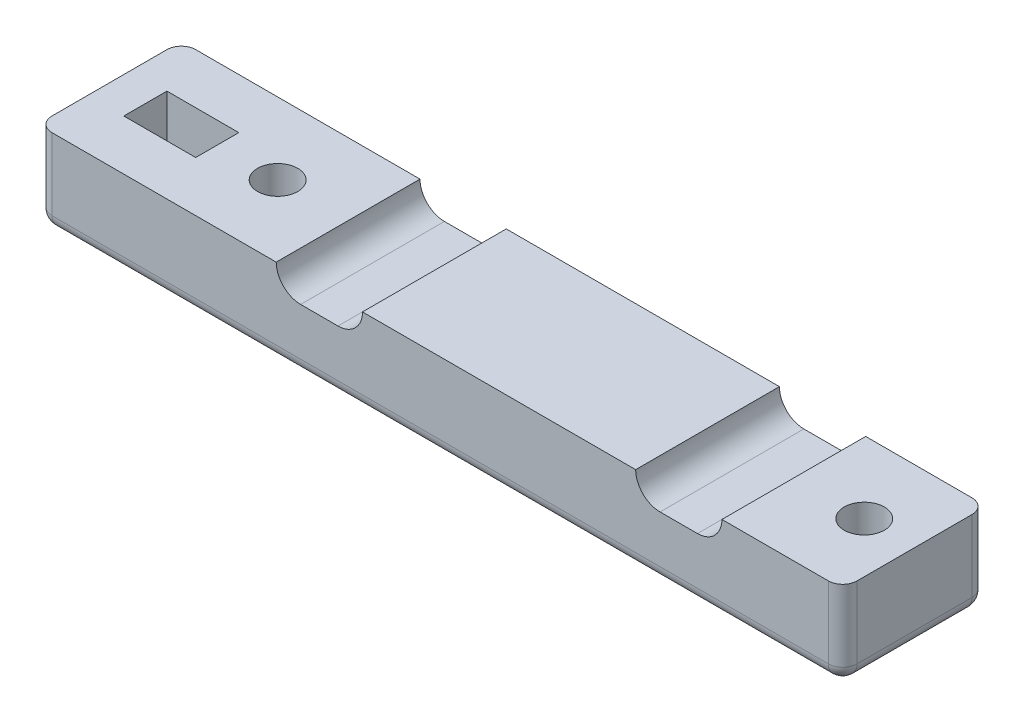
ISO-10303-21;
HEADER;
FILE_DESCRIPTION(('STEP AP214'),'2;1');
FILE_NAME('part.step','',(''),(''),'','','');
FILE_SCHEMA(('AUTOMOTIVE_DESIGN { 1 0 10303 214 1 1 1 1 }'));
ENDSEC;
DATA;
#1=APPLICATION_CONTEXT('core data for automotive mechanical design processes');
#2=APPLICATION_PROTOCOL_DEFINITION('international standard','automotive_design',2000,#1);
#3=PRODUCT_CONTEXT('',#1,'mechanical');
#4=PRODUCT('Part','Part','',(#3));
#5=PRODUCT_RELATED_PRODUCT_CATEGORY('part','',(#4));
#6=PRODUCT_DEFINITION_FORMATION('','',#4);
#7=PRODUCT_DEFINITION_CONTEXT('part definition',#1,'design');
#8=PRODUCT_DEFINITION('design','',#6,#7);
#9=PRODUCT_DEFINITION_SHAPE('','',#8);
#10=(LENGTH_UNIT() NAMED_UNIT(*) SI_UNIT(.MILLI.,.METRE.));
#11=(NAMED_UNIT(*) PLANE_ANGLE_UNIT() SI_UNIT($,.RADIAN.));
#12=(NAMED_UNIT(*) SI_UNIT($,.STERADIAN.) SOLID_ANGLE_UNIT());
#13=UNCERTAINTY_MEASURE_WITH_UNIT(LENGTH_MEASURE(1.E-05),#10,'distance_accuracy_value','');
#14=(GEOMETRIC_REPRESENTATION_CONTEXT(3) GLOBAL_UNCERTAINTY_ASSIGNED_CONTEXT((#13)) GLOBAL_UNIT_ASSIGNED_CONTEXT((#10,
#11,#12)) REPRESENTATION_CONTEXT('',''));
#15=CARTESIAN_POINT('',(0.,0.,0.));
#16=DIRECTION('',(0.,0.,1.));
#17=DIRECTION('',(1.,0.,0.));
#18=AXIS2_PLACEMENT_3D('',#15,#16,#17);
#19=CARTESIAN_POINT('',(0.,6.,0.));
#20=DIRECTION('',(0.,1.,0.));
#21=DIRECTION('',(0.,0.,1.));
#22=AXIS2_PLACEMENT_3D('',#19,#20,#21);
#23=PLANE('',#22);
#24=DIRECTION('',(0.,0.,-1.));
#25=VECTOR('',#24,1.);
#26=CARTESIAN_POINT('',(13.6,6.,5.));
#27=LINE('',#26,#25);
#28=CARTESIAN_POINT('',(13.6,6.,5.));
#29=VERTEX_POINT('',#28);
#30=CARTESIAN_POINT('',(13.6,6.,-5.));
#31=VERTEX_POINT('',#30);
#32=EDGE_CURVE('E188',#29,#31,#27,.T.);
#33=ORIENTED_EDGE('',*,*,#32,.T.);
#34=DIRECTION('',(-1.,0.,0.));
#35=VECTOR('',#34,1.);
#36=CARTESIAN_POINT('',(-28.,6.,-5.));
#37=LINE('',#36,#35);
#38=CARTESIAN_POINT('',(-5.4,6.,-5.));
#39=VERTEX_POINT('',#38);
#40=EDGE_CURVE('E368',#31,#39,#37,.T.);
#41=ORIENTED_EDGE('',*,*,#40,.T.);
#42=DIRECTION('',(0.,0.,-1.));
#43=VECTOR('',#42,1.);
#44=CARTESIAN_POINT('',(-5.4,6.,5.));
#45=LINE('',#44,#43);
#46=CARTESIAN_POINT('',(-5.4,6.,5.));
#47=VERTEX_POINT('',#46);
#48=EDGE_CURVE('E212',#47,#39,#45,.T.);
#49=ORIENTED_EDGE('',*,*,#48,.F.);
#50=DIRECTION('',(1.,0.,0.));
#51=VECTOR('',#50,1.);
#52=CARTESIAN_POINT('',(-28.,6.,5.));
#53=LINE('',#52,#51);
#54=EDGE_CURVE('E206',#47,#29,#53,.T.);
#55=ORIENTED_EDGE('',*,*,#54,.T.);
#56=EDGE_LOOP('',(#33,#41,#49,#55));
#57=FACE_BOUND('',#56,.T.);
#58=ADVANCED_FACE('F37',(#57),#23,.T.);
#59=DIRECTION('',(0.,0.,-1.));
#60=VECTOR('',#59,1.);
#61=CARTESIAN_POINT('',(28.,6.,-5.));
#62=LINE('',#61,#60);
#63=CARTESIAN_POINT('',(28.,6.,4.));
#64=VERTEX_POINT('',#63);
#65=CARTESIAN_POINT('',(28.,6.,-4.));
#66=VERTEX_POINT('',#65);
#67=EDGE_CURVE('E362',#64,#66,#62,.T.);
#68=ORIENTED_EDGE('',*,*,#67,.T.);
#69=CARTESIAN_POINT('',(27.,6.,-4.));
#70=DIRECTION('',(0.,1.,0.));
#71=DIRECTION('',(0.,0.,1.));
#72=AXIS2_PLACEMENT_3D('',#69,#70,#71);
#73=CIRCLE('',#72,1.);
#74=CARTESIAN_POINT('',(27.,6.,-5.));
#75=VERTEX_POINT('',#74);
#76=EDGE_CURVE('E236',#66,#75,#73,.T.);
#77=ORIENTED_EDGE('',*,*,#76,.T.);
#78=CARTESIAN_POINT('',(19.6,6.,-5.));
#79=VERTEX_POINT('',#78);
#80=EDGE_CURVE('E367',#75,#79,#37,.T.);
#81=ORIENTED_EDGE('',*,*,#80,.T.);
#82=DIRECTION('',(0.,0.,-1.));
#83=VECTOR('',#82,1.);
#84=CARTESIAN_POINT('',(19.6,6.,5.));
#85=LINE('',#84,#83);
#86=CARTESIAN_POINT('',(19.6,6.,5.));
#87=VERTEX_POINT('',#86);
#88=EDGE_CURVE('E199',#87,#79,#85,.T.);
#89=ORIENTED_EDGE('',*,*,#88,.F.);
#90=CARTESIAN_POINT('',(27.,6.,5.));
#91=VERTEX_POINT('',#90);
#92=EDGE_CURVE('E214',#87,#91,#53,.T.);
#93=ORIENTED_EDGE('',*,*,#92,.T.);
#94=CARTESIAN_POINT('',(27.,6.,4.));
#95=DIRECTION('',(0.,1.,0.));
#96=DIRECTION('',(0.,0.,1.));
#97=AXIS2_PLACEMENT_3D('',#94,#95,#96);
#98=CIRCLE('',#97,1.);
#99=EDGE_CURVE('E234',#91,#64,#98,.T.);
#100=ORIENTED_EDGE('',*,*,#99,.T.);
#101=EDGE_LOOP('',(#68,#77,#81,#89,#93,#100));
#102=FACE_BOUND('',#101,.T.);
#103=CARTESIAN_POINT('',(24.5,6.,0.));
#104=DIRECTION('',(0.,1.,0.));
#105=DIRECTION('',(0.,0.,1.));
#106=AXIS2_PLACEMENT_3D('',#103,#104,#105);
#107=CIRCLE('',#106,1.4);
#108=CARTESIAN_POINT('',(24.5,6.,1.4));
#109=VERTEX_POINT('',#108);
#110=EDGE_CURVE('E353',#109,#109,#107,.T.);
#111=ORIENTED_EDGE('',*,*,#110,.F.);
#112=EDGE_LOOP('',(#111));
#113=FACE_BOUND('',#112,.T.);
#114=ADVANCED_FACE('F417',(#102,#113),#23,.T.);
#115=CARTESIAN_POINT('',(-11.4,6.,-5.));
#116=VERTEX_POINT('',#115);
#117=CARTESIAN_POINT('',(-27.,6.,-5.));
#118=VERTEX_POINT('',#117);
#119=EDGE_CURVE('E366',#116,#118,#37,.T.);
#120=ORIENTED_EDGE('',*,*,#119,.T.);
#121=CARTESIAN_POINT('',(-27.,6.,-4.));
#122=DIRECTION('',(0.,1.,0.));
#123=DIRECTION('',(0.,0.,1.));
#124=AXIS2_PLACEMENT_3D('',#121,#122,#123);
#125=CIRCLE('',#124,1.);
#126=CARTESIAN_POINT('',(-28.,6.,-4.));
#127=VERTEX_POINT('',#126);
#128=EDGE_CURVE('E252',#118,#127,#125,.T.);
#129=ORIENTED_EDGE('',*,*,#128,.T.);
#130=DIRECTION('',(0.,0.,1.));
#131=VECTOR('',#130,1.);
#132=CARTESIAN_POINT('',(-28.,6.,-5.));
#133=LINE('',#132,#131);
#134=CARTESIAN_POINT('',(-28.,6.,4.));
#135=VERTEX_POINT('',#134);
#136=EDGE_CURVE('E218',#127,#135,#133,.T.);
#137=ORIENTED_EDGE('',*,*,#136,.T.);
#138=CARTESIAN_POINT('',(-27.,6.,4.));
#139=DIRECTION('',(0.,1.,0.));
#140=DIRECTION('',(0.,0.,1.));
#141=AXIS2_PLACEMENT_3D('',#138,#139,#140);
#142=CIRCLE('',#141,1.);
#143=CARTESIAN_POINT('',(-27.,6.,5.));
#144=VERTEX_POINT('',#143);
#145=EDGE_CURVE('E250',#135,#144,#142,.T.);
#146=ORIENTED_EDGE('',*,*,#145,.T.);
#147=CARTESIAN_POINT('',(-11.4,6.,5.));
#148=VERTEX_POINT('',#147);
#149=EDGE_CURVE('E213',#144,#148,#53,.T.);
#150=ORIENTED_EDGE('',*,*,#149,.T.);
#151=DIRECTION('',(0.,0.,-1.));
#152=VECTOR('',#151,1.);
#153=CARTESIAN_POINT('',(-11.4,6.,5.));
#154=LINE('',#153,#152);
#155=EDGE_CURVE('E294',#148,#116,#154,.T.);
#156=ORIENTED_EDGE('',*,*,#155,.T.);
#157=EDGE_LOOP('',(#120,#129,#137,#146,#150,#156));
#158=FACE_BOUND('',#157,.T.);
#159=CARTESIAN_POINT('',(-16.3,6.,0.));
#160=DIRECTION('',(0.,1.,0.));
#161=DIRECTION('',(0.,0.,1.));
#162=AXIS2_PLACEMENT_3D('',#159,#160,#161);
#163=CIRCLE('',#162,1.4);
#164=CARTESIAN_POINT('',(-16.3,6.,1.4));
#165=VERTEX_POINT('',#164);
#166=EDGE_CURVE('E359',#165,#165,#163,.T.);
#167=ORIENTED_EDGE('',*,*,#166,.F.);
#168=EDGE_LOOP('',(#167));
#169=FACE_BOUND('',#168,.T.);
#170=DIRECTION('',(1.,0.,0.));
#171=VECTOR('',#170,1.);
#172=CARTESIAN_POINT('',(-25.5,6.,1.5));
#173=LINE('',#172,#171);
#174=CARTESIAN_POINT('',(-25.5,6.,1.5));
#175=VERTEX_POINT('',#174);
#176=CARTESIAN_POINT('',(-20.5,6.,1.5));
#177=VERTEX_POINT('',#176);
#178=EDGE_CURVE('E322',#175,#177,#173,.T.);
#179=ORIENTED_EDGE('',*,*,#178,.F.);
#180=DIRECTION('',(0.,0.,1.));
#181=VECTOR('',#180,1.);
#182=CARTESIAN_POINT('',(-25.5,6.,-1.5));
#183=LINE('',#182,#181);
#184=CARTESIAN_POINT('',(-25.5,6.,-1.5));
#185=VERTEX_POINT('',#184);
#186=EDGE_CURVE('E320',#185,#175,#183,.T.);
#187=ORIENTED_EDGE('',*,*,#186,.F.);
#188=DIRECTION('',(-1.,0.,0.));
#189=VECTOR('',#188,1.);
#190=CARTESIAN_POINT('',(-25.5,6.,-1.5));
#191=LINE('',#190,#189);
#192=CARTESIAN_POINT('',(-20.5,6.,-1.5));
#193=VERTEX_POINT('',#192);
#194=EDGE_CURVE('E328',#193,#185,#191,.T.);
#195=ORIENTED_EDGE('',*,*,#194,.F.);
#196=DIRECTION('',(0.,0.,-1.));
#197=VECTOR('',#196,1.);
#198=CARTESIAN_POINT('',(-20.5,6.,-1.5));
#199=LINE('',#198,#197);
#200=EDGE_CURVE('E325',#177,#193,#199,.T.);
#201=ORIENTED_EDGE('',*,*,#200,.F.);
#202=EDGE_LOOP('',(#179,#187,#195,#201));
#203=FACE_BOUND('',#202,.T.);
#204=ADVANCED_FACE('F378',(#158,#169,#203),#23,.T.);
#205=CARTESIAN_POINT('',(0.,0.,0.));
#206=DIRECTION('',(0.,1.,0.));
#207=DIRECTION('',(0.,0.,1.));
#208=AXIS2_PLACEMENT_3D('',#205,#206,#207);
#209=PLANE('',#208);
#210=DIRECTION('',(1.,0.,0.));
#211=VECTOR('',#210,1.);
#212=CARTESIAN_POINT('',(0.,0.,4.));
#213=LINE('',#212,#211);
#214=CARTESIAN_POINT('',(27.,0.,4.));
#215=VERTEX_POINT('',#214);
#216=CARTESIAN_POINT('',(-27.,0.,4.));
#217=VERTEX_POINT('',#216);
#218=EDGE_CURVE('E60',#215,#217,#213,.F.);
#219=ORIENTED_EDGE('',*,*,#218,.T.);
#220=DIRECTION('',(0.,0.,1.));
#221=VECTOR('',#220,1.);
#222=CARTESIAN_POINT('',(-27.,0.,0.));
#223=LINE('',#222,#221);
#224=CARTESIAN_POINT('',(-27.,0.,-4.));
#225=VERTEX_POINT('',#224);
#226=EDGE_CURVE('E11',#217,#225,#223,.F.);
#227=ORIENTED_EDGE('',*,*,#226,.T.);
#228=DIRECTION('',(-1.,0.,0.));
#229=VECTOR('',#228,1.);
#230=CARTESIAN_POINT('',(0.,0.,-4.));
#231=LINE('',#230,#229);
#232=CARTESIAN_POINT('',(27.,0.,-4.));
#233=VERTEX_POINT('',#232);
#234=EDGE_CURVE('E46',#225,#233,#231,.F.);
#235=ORIENTED_EDGE('',*,*,#234,.T.);
#236=DIRECTION('',(0.,0.,-1.));
#237=VECTOR('',#236,1.);
#238=CARTESIAN_POINT('',(27.,0.,0.));
#239=LINE('',#238,#237);
#240=EDGE_CURVE('E254',#233,#215,#239,.F.);
#241=ORIENTED_EDGE('',*,*,#240,.T.);
#242=EDGE_LOOP('',(#219,#227,#235,#241));
#243=FACE_BOUND('',#242,.T.);
#244=CARTESIAN_POINT('',(24.5,0.,0.));
#245=DIRECTION('',(0.,1.,0.));
#246=DIRECTION('',(0.,0.,1.));
#247=AXIS2_PLACEMENT_3D('',#244,#245,#246);
#248=CIRCLE('',#247,1.4);
#249=CARTESIAN_POINT('',(24.5,0.,1.4));
#250=VERTEX_POINT('',#249);
#251=EDGE_CURVE('E352',#250,#250,#248,.T.);
#252=ORIENTED_EDGE('',*,*,#251,.T.);
#253=EDGE_LOOP('',(#252));
#254=FACE_BOUND('',#253,.T.);
#255=CARTESIAN_POINT('',(-16.3,0.,0.));
#256=DIRECTION('',(0.,1.,0.));
#257=DIRECTION('',(0.,0.,1.));
#258=AXIS2_PLACEMENT_3D('',#255,#256,#257);
#259=CIRCLE('',#258,1.4);
#260=CARTESIAN_POINT('',(-16.3,0.,1.4));
#261=VERTEX_POINT('',#260);
#262=EDGE_CURVE('E356',#261,#261,#259,.T.);
#263=ORIENTED_EDGE('',*,*,#262,.T.);
#264=EDGE_LOOP('',(#263));
#265=FACE_BOUND('',#264,.T.);
#266=DIRECTION('',(0.,0.,1.));
#267=VECTOR('',#266,1.);
#268=CARTESIAN_POINT('',(-25.5,0.,-1.5));
#269=LINE('',#268,#267);
#270=CARTESIAN_POINT('',(-25.5,0.,-1.5));
#271=VERTEX_POINT('',#270);
#272=CARTESIAN_POINT('',(-25.5,0.,1.5));
#273=VERTEX_POINT('',#272);
#274=EDGE_CURVE('E331',#271,#273,#269,.T.);
#275=ORIENTED_EDGE('',*,*,#274,.T.);
#276=DIRECTION('',(1.,0.,0.));
#277=VECTOR('',#276,1.);
#278=CARTESIAN_POINT('',(-25.5,0.,1.5));
#279=LINE('',#278,#277);
#280=CARTESIAN_POINT('',(-20.5,0.,1.5));
#281=VERTEX_POINT('',#280);
#282=EDGE_CURVE('E334',#273,#281,#279,.T.);
#283=ORIENTED_EDGE('',*,*,#282,.T.);
#284=DIRECTION('',(0.,0.,-1.));
#285=VECTOR('',#284,1.);
#286=CARTESIAN_POINT('',(-20.5,0.,-1.5));
#287=LINE('',#286,#285);
#288=CARTESIAN_POINT('',(-20.5,0.,-1.5));
#289=VERTEX_POINT('',#288);
#290=EDGE_CURVE('E338',#281,#289,#287,.T.);
#291=ORIENTED_EDGE('',*,*,#290,.T.);
#292=DIRECTION('',(-1.,0.,0.));
#293=VECTOR('',#292,1.);
#294=CARTESIAN_POINT('',(-25.5,0.,-1.5));
#295=LINE('',#294,#293);
#296=EDGE_CURVE('E323',#289,#271,#295,.T.);
#297=ORIENTED_EDGE('',*,*,#296,.T.);
#298=EDGE_LOOP('',(#275,#283,#291,#297));
#299=FACE_BOUND('',#298,.T.);
#300=ADVANCED_FACE('F395',(#243,#254,#265,#299),#209,.F.);
#301=CARTESIAN_POINT('',(28.,6.,-5.));
#302=DIRECTION('',(-1.,0.,0.));
#303=DIRECTION('',(0.,0.,1.));
#304=AXIS2_PLACEMENT_3D('',#301,#302,#303);
#305=PLANE('',#304);
#306=DIRECTION('',(0.,0.,-1.));
#307=VECTOR('',#306,1.);
#308=CARTESIAN_POINT('',(28.,1.,-5.));
#309=LINE('',#308,#307);
#310=CARTESIAN_POINT('',(28.,1.,4.));
#311=VERTEX_POINT('',#310);
#312=CARTESIAN_POINT('',(28.,1.,-4.));
#313=VERTEX_POINT('',#312);
#314=EDGE_CURVE('E228',#311,#313,#309,.T.);
#315=ORIENTED_EDGE('',*,*,#314,.T.);
#316=DIRECTION('',(0.,-1.,0.));
#317=VECTOR('',#316,1.);
#318=CARTESIAN_POINT('',(28.,6.,-4.));
#319=LINE('',#318,#317);
#320=EDGE_CURVE('E232',#313,#66,#319,.F.);
#321=ORIENTED_EDGE('',*,*,#320,.T.);
#322=ORIENTED_EDGE('',*,*,#67,.F.);
#323=DIRECTION('',(0.,-1.,0.));
#324=VECTOR('',#323,1.);
#325=CARTESIAN_POINT('',(28.,6.,4.));
#326=LINE('',#325,#324);
#327=EDGE_CURVE('E230',#64,#311,#326,.T.);
#328=ORIENTED_EDGE('',*,*,#327,.T.);
#329=EDGE_LOOP('',(#315,#321,#322,#328));
#330=FACE_BOUND('',#329,.T.);
#331=ADVANCED_FACE('F415',(#330),#305,.F.);
#332=CARTESIAN_POINT('',(-28.,6.,-5.));
#333=DIRECTION('',(0.,0.,1.));
#334=DIRECTION('',(1.,0.,0.));
#335=AXIS2_PLACEMENT_3D('',#332,#333,#334);
#336=PLANE('',#335);
#337=ORIENTED_EDGE('',*,*,#80,.F.);
#338=DIRECTION('',(0.,-1.,0.));
#339=VECTOR('',#338,1.);
#340=CARTESIAN_POINT('',(27.,6.,-5.));
#341=LINE('',#340,#339);
#342=CARTESIAN_POINT('',(27.,1.,-5.));
#343=VERTEX_POINT('',#342);
#344=EDGE_CURVE('E225',#75,#343,#341,.T.);
#345=ORIENTED_EDGE('',*,*,#344,.T.);
#346=DIRECTION('',(-1.,0.,0.));
#347=VECTOR('',#346,1.);
#348=CARTESIAN_POINT('',(-28.,1.,-5.));
#349=LINE('',#348,#347);
#350=CARTESIAN_POINT('',(-27.,1.,-5.));
#351=VERTEX_POINT('',#350);
#352=EDGE_CURVE('E216',#343,#351,#349,.T.);
#353=ORIENTED_EDGE('',*,*,#352,.T.);
#354=DIRECTION('',(0.,-1.,0.));
#355=VECTOR('',#354,1.);
#356=CARTESIAN_POINT('',(-27.,6.,-5.));
#357=LINE('',#356,#355);
#358=EDGE_CURVE('E223',#351,#118,#357,.F.);
#359=ORIENTED_EDGE('',*,*,#358,.T.);
#360=ORIENTED_EDGE('',*,*,#119,.F.);
#361=CARTESIAN_POINT('',(-9.7,6.,-5.));
#362=DIRECTION('',(0.,0.,-1.));
#363=DIRECTION('',(-1.,0.,0.));
#364=AXIS2_PLACEMENT_3D('',#361,#362,#363);
#365=CIRCLE('',#364,1.7);
#366=CARTESIAN_POINT('',(-9.7,4.3,-5.));
#367=VERTEX_POINT('',#366);
#368=EDGE_CURVE('E304',#367,#116,#365,.T.);
#369=ORIENTED_EDGE('',*,*,#368,.F.);
#370=DIRECTION('',(-1.,0.,0.));
#371=VECTOR('',#370,1.);
#372=CARTESIAN_POINT('',(-7.1,4.3,-5.));
#373=LINE('',#372,#371);
#374=CARTESIAN_POINT('',(-7.1,4.3,-5.));
#375=VERTEX_POINT('',#374);
#376=EDGE_CURVE('E306',#375,#367,#373,.T.);
#377=ORIENTED_EDGE('',*,*,#376,.F.);
#378=CARTESIAN_POINT('',(-7.1,6.,-5.));
#379=DIRECTION('',(0.,0.,-1.));
#380=DIRECTION('',(1.,0.,0.));
#381=AXIS2_PLACEMENT_3D('',#378,#379,#380);
#382=CIRCLE('',#381,1.7);
#383=EDGE_CURVE('E310',#39,#375,#382,.T.);
#384=ORIENTED_EDGE('',*,*,#383,.F.);
#385=ORIENTED_EDGE('',*,*,#40,.F.);
#386=CARTESIAN_POINT('',(15.3,6.,-5.));
#387=DIRECTION('',(0.,0.,-1.));
#388=DIRECTION('',(-1.,0.,0.));
#389=AXIS2_PLACEMENT_3D('',#386,#387,#388);
#390=CIRCLE('',#389,1.7);
#391=CARTESIAN_POINT('',(15.3,4.3,-5.));
#392=VERTEX_POINT('',#391);
#393=EDGE_CURVE('E194',#392,#31,#390,.T.);
#394=ORIENTED_EDGE('',*,*,#393,.F.);
#395=DIRECTION('',(-1.,0.,0.));
#396=VECTOR('',#395,1.);
#397=CARTESIAN_POINT('',(17.9,4.3,-5.));
#398=LINE('',#397,#396);
#399=CARTESIAN_POINT('',(17.9,4.3,-5.));
#400=VERTEX_POINT('',#399);
#401=EDGE_CURVE('E209',#400,#392,#398,.T.);
#402=ORIENTED_EDGE('',*,*,#401,.F.);
#403=CARTESIAN_POINT('',(17.9,6.,-5.));
#404=DIRECTION('',(0.,0.,-1.));
#405=DIRECTION('',(1.,0.,0.));
#406=AXIS2_PLACEMENT_3D('',#403,#404,#405);
#407=CIRCLE('',#406,1.7);
#408=EDGE_CURVE('E801',#79,#400,#407,.T.);
#409=ORIENTED_EDGE('',*,*,#408,.F.);
#410=EDGE_LOOP('',(#337,#345,#353,#359,#360,#369,#377,#384,#385,#394,#402,#409));
#411=FACE_BOUND('',#410,.T.);
#412=ADVANCED_FACE('F454',(#411),#336,.F.);
#413=CARTESIAN_POINT('',(-28.,6.,-5.));
#414=DIRECTION('',(1.,0.,0.));
#415=DIRECTION('',(0.,0.,-1.));
#416=AXIS2_PLACEMENT_3D('',#413,#414,#415);
#417=PLANE('',#416);
#418=ORIENTED_EDGE('',*,*,#136,.F.);
#419=DIRECTION('',(0.,-1.,0.));
#420=VECTOR('',#419,1.);
#421=CARTESIAN_POINT('',(-28.,6.,-4.));
#422=LINE('',#421,#420);
#423=CARTESIAN_POINT('',(-28.,1.,-4.));
#424=VERTEX_POINT('',#423);
#425=EDGE_CURVE('E248',#127,#424,#422,.T.);
#426=ORIENTED_EDGE('',*,*,#425,.T.);
#427=DIRECTION('',(0.,0.,1.));
#428=VECTOR('',#427,1.);
#429=CARTESIAN_POINT('',(-28.,1.,-5.));
#430=LINE('',#429,#428);
#431=CARTESIAN_POINT('',(-28.,1.,4.));
#432=VERTEX_POINT('',#431);
#433=EDGE_CURVE('E244',#424,#432,#430,.T.);
#434=ORIENTED_EDGE('',*,*,#433,.T.);
#435=DIRECTION('',(0.,-1.,0.));
#436=VECTOR('',#435,1.);
#437=CARTESIAN_POINT('',(-28.,6.,4.));
#438=LINE('',#437,#436);
#439=EDGE_CURVE('E246',#432,#135,#438,.F.);
#440=ORIENTED_EDGE('',*,*,#439,.T.);
#441=EDGE_LOOP('',(#418,#426,#434,#440));
#442=FACE_BOUND('',#441,.T.);
#443=ADVANCED_FACE('F390',(#442),#417,.F.);
#444=CARTESIAN_POINT('',(-28.,6.,5.));
#445=DIRECTION('',(0.,0.,-1.));
#446=DIRECTION('',(-1.,0.,0.));
#447=AXIS2_PLACEMENT_3D('',#444,#445,#446);
#448=PLANE('',#447);
#449=DIRECTION('',(1.,0.,0.));
#450=VECTOR('',#449,1.);
#451=CARTESIAN_POINT('',(-28.,1.,5.));
#452=LINE('',#451,#450);
#453=CARTESIAN_POINT('',(-27.,1.,5.));
#454=VERTEX_POINT('',#453);
#455=CARTESIAN_POINT('',(27.,1.,5.));
#456=VERTEX_POINT('',#455);
#457=EDGE_CURVE('E238',#454,#456,#452,.T.);
#458=ORIENTED_EDGE('',*,*,#457,.T.);
#459=DIRECTION('',(0.,-1.,0.));
#460=VECTOR('',#459,1.);
#461=CARTESIAN_POINT('',(27.,6.,5.));
#462=LINE('',#461,#460);
#463=EDGE_CURVE('E242',#456,#91,#462,.F.);
#464=ORIENTED_EDGE('',*,*,#463,.T.);
#465=ORIENTED_EDGE('',*,*,#92,.F.);
#466=CARTESIAN_POINT('',(17.9,6.,5.));
#467=DIRECTION('',(0.,0.,-1.));
#468=DIRECTION('',(1.,0.,0.));
#469=AXIS2_PLACEMENT_3D('',#466,#467,#468);
#470=CIRCLE('',#469,1.7);
#471=CARTESIAN_POINT('',(17.9,4.3,5.));
#472=VERTEX_POINT('',#471);
#473=EDGE_CURVE('E208',#87,#472,#470,.T.);
#474=ORIENTED_EDGE('',*,*,#473,.T.);
#475=DIRECTION('',(-1.,0.,0.));
#476=VECTOR('',#475,1.);
#477=CARTESIAN_POINT('',(17.9,4.3,5.));
#478=LINE('',#477,#476);
#479=CARTESIAN_POINT('',(15.3,4.3,5.));
#480=VERTEX_POINT('',#479);
#481=EDGE_CURVE('E200',#472,#480,#478,.T.);
#482=ORIENTED_EDGE('',*,*,#481,.T.);
#483=CARTESIAN_POINT('',(15.3,6.,5.));
#484=DIRECTION('',(0.,0.,-1.));
#485=DIRECTION('',(-1.,0.,0.));
#486=AXIS2_PLACEMENT_3D('',#483,#484,#485);
#487=CIRCLE('',#486,1.7);
#488=EDGE_CURVE('E191',#480,#29,#487,.T.);
#489=ORIENTED_EDGE('',*,*,#488,.T.);
#490=ORIENTED_EDGE('',*,*,#54,.F.);
#491=CARTESIAN_POINT('',(-7.1,6.,5.));
#492=DIRECTION('',(0.,0.,-1.));
#493=DIRECTION('',(1.,0.,0.));
#494=AXIS2_PLACEMENT_3D('',#491,#492,#493);
#495=CIRCLE('',#494,1.7);
#496=CARTESIAN_POINT('',(-7.1,4.3,5.));
#497=VERTEX_POINT('',#496);
#498=EDGE_CURVE('E307',#47,#497,#495,.T.);
#499=ORIENTED_EDGE('',*,*,#498,.T.);
#500=DIRECTION('',(-1.,0.,0.));
#501=VECTOR('',#500,1.);
#502=CARTESIAN_POINT('',(-7.1,4.3,5.));
#503=LINE('',#502,#501);
#504=CARTESIAN_POINT('',(-9.7,4.3,5.));
#505=VERTEX_POINT('',#504);
#506=EDGE_CURVE('E315',#497,#505,#503,.T.);
#507=ORIENTED_EDGE('',*,*,#506,.T.);
#508=CARTESIAN_POINT('',(-9.7,6.,5.));
#509=DIRECTION('',(0.,0.,-1.));
#510=DIRECTION('',(-1.,0.,0.));
#511=AXIS2_PLACEMENT_3D('',#508,#509,#510);
#512=CIRCLE('',#511,1.7);
#513=EDGE_CURVE('E312',#505,#148,#512,.T.);
#514=ORIENTED_EDGE('',*,*,#513,.T.);
#515=ORIENTED_EDGE('',*,*,#149,.F.);
#516=DIRECTION('',(0.,-1.,0.));
#517=VECTOR('',#516,1.);
#518=CARTESIAN_POINT('',(-27.,6.,5.));
#519=LINE('',#518,#517);
#520=EDGE_CURVE('E240',#144,#454,#519,.T.);
#521=ORIENTED_EDGE('',*,*,#520,.T.);
#522=EDGE_LOOP('',(#458,#464,#465,#474,#482,#489,#490,#499,#507,#514,#515,#521));
#523=FACE_BOUND('',#522,.T.);
#524=ADVANCED_FACE('F204',(#523),#448,.F.);
#525=CARTESIAN_POINT('',(-16.3,6.,0.));
#526=DIRECTION('',(0.,-1.,0.));
#527=DIRECTION('',(0.,0.,-1.));
#528=AXIS2_PLACEMENT_3D('',#525,#526,#527);
#529=CYLINDRICAL_SURFACE('',#528,1.4);
#530=ORIENTED_EDGE('',*,*,#166,.T.);
#531=EDGE_LOOP('',(#530));
#532=FACE_BOUND('',#531,.T.);
#533=ORIENTED_EDGE('',*,*,#262,.F.);
#534=EDGE_LOOP('',(#533));
#535=FACE_BOUND('',#534,.T.);
#536=ADVANCED_FACE('F459',(#532,#535),#529,.F.);
#537=CARTESIAN_POINT('',(24.5,6.,0.));
#538=DIRECTION('',(0.,-1.,0.));
#539=DIRECTION('',(0.,0.,-1.));
#540=AXIS2_PLACEMENT_3D('',#537,#538,#539);
#541=CYLINDRICAL_SURFACE('',#540,1.4);
#542=ORIENTED_EDGE('',*,*,#110,.T.);
#543=EDGE_LOOP('',(#542));
#544=FACE_BOUND('',#543,.T.);
#545=ORIENTED_EDGE('',*,*,#251,.F.);
#546=EDGE_LOOP('',(#545));
#547=FACE_BOUND('',#546,.T.);
#548=ADVANCED_FACE('F691',(#544,#547),#541,.F.);
#549=CARTESIAN_POINT('',(-25.5,6.,-1.5));
#550=DIRECTION('',(1.,0.,0.));
#551=DIRECTION('',(0.,0.,-1.));
#552=AXIS2_PLACEMENT_3D('',#549,#550,#551);
#553=PLANE('',#552);
#554=ORIENTED_EDGE('',*,*,#274,.F.);
#555=DIRECTION('',(0.,-1.,0.));
#556=VECTOR('',#555,1.);
#557=CARTESIAN_POINT('',(-25.5,6.,-1.5));
#558=LINE('',#557,#556);
#559=EDGE_CURVE('E330',#185,#271,#558,.T.);
#560=ORIENTED_EDGE('',*,*,#559,.F.);
#561=ORIENTED_EDGE('',*,*,#186,.T.);
#562=DIRECTION('',(0.,-1.,0.));
#563=VECTOR('',#562,1.);
#564=CARTESIAN_POINT('',(-25.5,6.,1.5));
#565=LINE('',#564,#563);
#566=EDGE_CURVE('E349',#175,#273,#565,.T.);
#567=ORIENTED_EDGE('',*,*,#566,.T.);
#568=EDGE_LOOP('',(#554,#560,#561,#567));
#569=FACE_BOUND('',#568,.T.);
#570=ADVANCED_FACE('F680',(#569),#553,.T.);
#571=CARTESIAN_POINT('',(-25.5,6.,1.5));
#572=DIRECTION('',(0.,0.,-1.));
#573=DIRECTION('',(-1.,0.,0.));
#574=AXIS2_PLACEMENT_3D('',#571,#572,#573);
#575=PLANE('',#574);
#576=ORIENTED_EDGE('',*,*,#282,.F.);
#577=ORIENTED_EDGE('',*,*,#566,.F.);
#578=ORIENTED_EDGE('',*,*,#178,.T.);
#579=DIRECTION('',(0.,-1.,0.));
#580=VECTOR('',#579,1.);
#581=CARTESIAN_POINT('',(-20.5,6.,1.5));
#582=LINE('',#581,#580);
#583=EDGE_CURVE('E347',#177,#281,#582,.T.);
#584=ORIENTED_EDGE('',*,*,#583,.T.);
#585=EDGE_LOOP('',(#576,#577,#578,#584));
#586=FACE_BOUND('',#585,.T.);
#587=ADVANCED_FACE('F669',(#586),#575,.T.);
#588=CARTESIAN_POINT('',(-20.5,6.,-1.5));
#589=DIRECTION('',(-1.,0.,0.));
#590=DIRECTION('',(0.,0.,1.));
#591=AXIS2_PLACEMENT_3D('',#588,#589,#590);
#592=PLANE('',#591);
#593=ORIENTED_EDGE('',*,*,#290,.F.);
#594=ORIENTED_EDGE('',*,*,#583,.F.);
#595=ORIENTED_EDGE('',*,*,#200,.T.);
#596=DIRECTION('',(0.,-1.,0.));
#597=VECTOR('',#596,1.);
#598=CARTESIAN_POINT('',(-20.5,6.,-1.5));
#599=LINE('',#598,#597);
#600=EDGE_CURVE('E345',#193,#289,#599,.T.);
#601=ORIENTED_EDGE('',*,*,#600,.T.);
#602=EDGE_LOOP('',(#593,#594,#595,#601));
#603=FACE_BOUND('',#602,.T.);
#604=ADVANCED_FACE('F658',(#603),#592,.T.);
#605=CARTESIAN_POINT('',(-25.5,6.,-1.5));
#606=DIRECTION('',(0.,0.,1.));
#607=DIRECTION('',(1.,0.,0.));
#608=AXIS2_PLACEMENT_3D('',#605,#606,#607);
#609=PLANE('',#608);
#610=ORIENTED_EDGE('',*,*,#296,.F.);
#611=ORIENTED_EDGE('',*,*,#600,.F.);
#612=ORIENTED_EDGE('',*,*,#194,.T.);
#613=ORIENTED_EDGE('',*,*,#559,.T.);
#614=EDGE_LOOP('',(#610,#611,#612,#613));
#615=FACE_BOUND('',#614,.T.);
#616=ADVANCED_FACE('F637',(#615),#609,.T.);
#617=CARTESIAN_POINT('',(-7.1,6.,5.));
#618=DIRECTION('',(0.,0.,-1.));
#619=DIRECTION('',(-1.,0.,0.));
#620=AXIS2_PLACEMENT_3D('',#617,#618,#619);
#621=CYLINDRICAL_SURFACE('',#620,1.7);
#622=ORIENTED_EDGE('',*,*,#383,.T.);
#623=DIRECTION('',(0.,0.,-1.));
#624=VECTOR('',#623,1.);
#625=CARTESIAN_POINT('',(-7.1,4.3,5.));
#626=LINE('',#625,#624);
#627=EDGE_CURVE('E316',#497,#375,#626,.T.);
#628=ORIENTED_EDGE('',*,*,#627,.F.);
#629=ORIENTED_EDGE('',*,*,#498,.F.);
#630=ORIENTED_EDGE('',*,*,#48,.T.);
#631=EDGE_LOOP('',(#622,#628,#629,#630));
#632=FACE_BOUND('',#631,.T.);
#633=ADVANCED_FACE('F626',(#632),#621,.F.);
#634=CARTESIAN_POINT('',(-9.7,6.,5.));
#635=DIRECTION('',(0.,0.,-1.));
#636=DIRECTION('',(-1.,0.,0.));
#637=AXIS2_PLACEMENT_3D('',#634,#635,#636);
#638=CYLINDRICAL_SURFACE('',#637,1.7);
#639=ORIENTED_EDGE('',*,*,#368,.T.);
#640=ORIENTED_EDGE('',*,*,#155,.F.);
#641=ORIENTED_EDGE('',*,*,#513,.F.);
#642=DIRECTION('',(0.,0.,-1.));
#643=VECTOR('',#642,1.);
#644=CARTESIAN_POINT('',(-9.7,4.3,5.));
#645=LINE('',#644,#643);
#646=EDGE_CURVE('E300',#505,#367,#645,.T.);
#647=ORIENTED_EDGE('',*,*,#646,.T.);
#648=EDGE_LOOP('',(#639,#640,#641,#647));
#649=FACE_BOUND('',#648,.T.);
#650=ADVANCED_FACE('F615',(#649),#638,.F.);
#651=CARTESIAN_POINT('',(-7.1,4.3,5.));
#652=DIRECTION('',(0.,-1.,0.));
#653=DIRECTION('',(0.,0.,-1.));
#654=AXIS2_PLACEMENT_3D('',#651,#652,#653);
#655=PLANE('',#654);
#656=ORIENTED_EDGE('',*,*,#376,.T.);
#657=ORIENTED_EDGE('',*,*,#646,.F.);
#658=ORIENTED_EDGE('',*,*,#506,.F.);
#659=ORIENTED_EDGE('',*,*,#627,.T.);
#660=EDGE_LOOP('',(#656,#657,#658,#659));
#661=FACE_BOUND('',#660,.T.);
#662=ADVANCED_FACE('F605',(#661),#655,.F.);
#663=CARTESIAN_POINT('',(15.3,6.,5.));
#664=DIRECTION('',(0.,0.,-1.));
#665=DIRECTION('',(-1.,0.,0.));
#666=AXIS2_PLACEMENT_3D('',#663,#664,#665);
#667=CYLINDRICAL_SURFACE('',#666,1.7);
#668=ORIENTED_EDGE('',*,*,#393,.T.);
#669=ORIENTED_EDGE('',*,*,#32,.F.);
#670=ORIENTED_EDGE('',*,*,#488,.F.);
#671=DIRECTION('',(0.,0.,-1.));
#672=VECTOR('',#671,1.);
#673=CARTESIAN_POINT('',(15.3,4.3,5.));
#674=LINE('',#673,#672);
#675=EDGE_CURVE('E335',#480,#392,#674,.T.);
#676=ORIENTED_EDGE('',*,*,#675,.T.);
#677=EDGE_LOOP('',(#668,#669,#670,#676));
#678=FACE_BOUND('',#677,.T.);
#679=ADVANCED_FACE('F190',(#678),#667,.F.);
#680=CARTESIAN_POINT('',(17.9,4.3,5.));
#681=DIRECTION('',(0.,-1.,0.));
#682=DIRECTION('',(0.,0.,-1.));
#683=AXIS2_PLACEMENT_3D('',#680,#681,#682);
#684=PLANE('',#683);
#685=ORIENTED_EDGE('',*,*,#401,.T.);
#686=ORIENTED_EDGE('',*,*,#675,.F.);
#687=ORIENTED_EDGE('',*,*,#481,.F.);
#688=DIRECTION('',(0.,0.,-1.));
#689=VECTOR('',#688,1.);
#690=CARTESIAN_POINT('',(17.9,4.3,5.));
#691=LINE('',#690,#689);
#692=EDGE_CURVE('E796',#472,#400,#691,.T.);
#693=ORIENTED_EDGE('',*,*,#692,.T.);
#694=EDGE_LOOP('',(#685,#686,#687,#693));
#695=FACE_BOUND('',#694,.T.);
#696=ADVANCED_FACE('F583',(#695),#684,.F.);
#697=CARTESIAN_POINT('',(17.9,6.,5.));
#698=DIRECTION('',(0.,0.,-1.));
#699=DIRECTION('',(-1.,0.,0.));
#700=AXIS2_PLACEMENT_3D('',#697,#698,#699);
#701=CYLINDRICAL_SURFACE('',#700,1.7);
#702=ORIENTED_EDGE('',*,*,#408,.T.);
#703=ORIENTED_EDGE('',*,*,#692,.F.);
#704=ORIENTED_EDGE('',*,*,#473,.F.);
#705=ORIENTED_EDGE('',*,*,#88,.T.);
#706=EDGE_LOOP('',(#702,#703,#704,#705));
#707=FACE_BOUND('',#706,.T.);
#708=ADVANCED_FACE('F438',(#707),#701,.F.);
#709=CARTESIAN_POINT('',(-27.,6.,4.));
#710=DIRECTION('',(0.,-1.,0.));
#711=DIRECTION('',(0.,0.,-1.));
#712=AXIS2_PLACEMENT_3D('',#709,#710,#711);
#713=CYLINDRICAL_SURFACE('',#712,1.);
#714=CARTESIAN_POINT('',(-27.,1.,4.));
#715=DIRECTION('',(0.,-1.,0.));
#716=DIRECTION('',(0.,0.,-1.));
#717=AXIS2_PLACEMENT_3D('',#714,#715,#716);
#718=CIRCLE('',#717,1.);
#719=EDGE_CURVE('E41',#454,#432,#718,.T.);
#720=ORIENTED_EDGE('',*,*,#719,.F.);
#721=ORIENTED_EDGE('',*,*,#520,.F.);
#722=ORIENTED_EDGE('',*,*,#145,.F.);
#723=ORIENTED_EDGE('',*,*,#439,.F.);
#724=EDGE_LOOP('',(#720,#721,#722,#723));
#725=FACE_BOUND('',#724,.T.);
#726=ADVANCED_FACE('F39',(#725),#713,.T.);
#727=CARTESIAN_POINT('',(-27.,1.,4.));
#728=DIRECTION('',(-1.,0.,0.));
#729=DIRECTION('',(0.,0.,1.));
#730=AXIS2_PLACEMENT_3D('',#727,#728,#729);
#731=SPHERICAL_SURFACE('',#730,1.);
#732=CARTESIAN_POINT('',(-27.,1.,4.));
#733=DIRECTION('',(-1.,0.,0.));
#734=DIRECTION('',(0.,0.,1.));
#735=AXIS2_PLACEMENT_3D('',#732,#733,#734);
#736=CIRCLE('',#735,1.);
#737=EDGE_CURVE('E283',#454,#217,#736,.F.);
#738=ORIENTED_EDGE('',*,*,#737,.F.);
#739=ORIENTED_EDGE('',*,*,#719,.T.);
#740=CARTESIAN_POINT('',(-27.,1.,4.));
#741=DIRECTION('',(0.,0.,1.));
#742=DIRECTION('',(1.,0.,0.));
#743=AXIS2_PLACEMENT_3D('',#740,#741,#742);
#744=CIRCLE('',#743,1.);
#745=EDGE_CURVE('E284',#217,#432,#744,.F.);
#746=ORIENTED_EDGE('',*,*,#745,.F.);
#747=EDGE_LOOP('',(#738,#739,#746));
#748=FACE_BOUND('',#747,.T.);
#749=ADVANCED_FACE('F431',(#748),#731,.T.);
#750=CARTESIAN_POINT('',(-27.,6.,-4.));
#751=DIRECTION('',(0.,-1.,0.));
#752=DIRECTION('',(0.,0.,-1.));
#753=AXIS2_PLACEMENT_3D('',#750,#751,#752);
#754=CYLINDRICAL_SURFACE('',#753,1.);
#755=ORIENTED_EDGE('',*,*,#128,.F.);
#756=ORIENTED_EDGE('',*,*,#358,.F.);
#757=CARTESIAN_POINT('',(-27.,1.,-4.));
#758=DIRECTION('',(0.,-1.,0.));
#759=DIRECTION('',(0.,0.,-1.));
#760=AXIS2_PLACEMENT_3D('',#757,#758,#759);
#761=CIRCLE('',#760,1.);
#762=EDGE_CURVE('E280',#424,#351,#761,.T.);
#763=ORIENTED_EDGE('',*,*,#762,.F.);
#764=ORIENTED_EDGE('',*,*,#425,.F.);
#765=EDGE_LOOP('',(#755,#756,#763,#764));
#766=FACE_BOUND('',#765,.T.);
#767=ADVANCED_FACE('F387',(#766),#754,.T.);
#768=CARTESIAN_POINT('',(-27.,1.,-5.));
#769=DIRECTION('',(0.,0.,1.));
#770=DIRECTION('',(1.,0.,0.));
#771=AXIS2_PLACEMENT_3D('',#768,#769,#770);
#772=CYLINDRICAL_SURFACE('',#771,1.);
#773=ORIENTED_EDGE('',*,*,#745,.T.);
#774=ORIENTED_EDGE('',*,*,#433,.F.);
#775=CARTESIAN_POINT('',(-27.,1.,-4.));
#776=DIRECTION('',(0.,0.,-1.));
#777=DIRECTION('',(-1.,0.,0.));
#778=AXIS2_PLACEMENT_3D('',#775,#776,#777);
#779=CIRCLE('',#778,1.);
#780=EDGE_CURVE('E277',#225,#424,#779,.T.);
#781=ORIENTED_EDGE('',*,*,#780,.F.);
#782=ORIENTED_EDGE('',*,*,#226,.F.);
#783=EDGE_LOOP('',(#773,#774,#781,#782));
#784=FACE_BOUND('',#783,.T.);
#785=ADVANCED_FACE('F393',(#784),#772,.T.);
#786=CARTESIAN_POINT('',(-28.,1.,4.));
#787=DIRECTION('',(1.,0.,0.));
#788=DIRECTION('',(0.,0.,-1.));
#789=AXIS2_PLACEMENT_3D('',#786,#787,#788);
#790=CYLINDRICAL_SURFACE('',#789,1.);
#791=ORIENTED_EDGE('',*,*,#737,.T.);
#792=ORIENTED_EDGE('',*,*,#218,.F.);
#793=CARTESIAN_POINT('',(27.,1.,4.));
#794=DIRECTION('',(1.,0.,0.));
#795=DIRECTION('',(0.,0.,-1.));
#796=AXIS2_PLACEMENT_3D('',#793,#794,#795);
#797=CIRCLE('',#796,1.);
#798=EDGE_CURVE('E274',#456,#215,#797,.T.);
#799=ORIENTED_EDGE('',*,*,#798,.F.);
#800=ORIENTED_EDGE('',*,*,#457,.F.);
#801=EDGE_LOOP('',(#791,#792,#799,#800));
#802=FACE_BOUND('',#801,.T.);
#803=ADVANCED_FACE('F430',(#802),#790,.T.);
#804=CARTESIAN_POINT('',(27.,6.,4.));
#805=DIRECTION('',(0.,-1.,0.));
#806=DIRECTION('',(0.,0.,-1.));
#807=AXIS2_PLACEMENT_3D('',#804,#805,#806);
#808=CYLINDRICAL_SURFACE('',#807,1.);
#809=ORIENTED_EDGE('',*,*,#99,.F.);
#810=ORIENTED_EDGE('',*,*,#463,.F.);
#811=CARTESIAN_POINT('',(27.,1.,4.));
#812=DIRECTION('',(0.,-1.,0.));
#813=DIRECTION('',(0.,0.,-1.));
#814=AXIS2_PLACEMENT_3D('',#811,#812,#813);
#815=CIRCLE('',#814,1.);
#816=EDGE_CURVE('E271',#311,#456,#815,.T.);
#817=ORIENTED_EDGE('',*,*,#816,.F.);
#818=ORIENTED_EDGE('',*,*,#327,.F.);
#819=EDGE_LOOP('',(#809,#810,#817,#818));
#820=FACE_BOUND('',#819,.T.);
#821=ADVANCED_FACE('F423',(#820),#808,.T.);
#822=CARTESIAN_POINT('',(-27.,1.,-4.));
#823=DIRECTION('',(-1.,0.,0.));
#824=DIRECTION('',(0.,0.,1.));
#825=AXIS2_PLACEMENT_3D('',#822,#823,#824);
#826=SPHERICAL_SURFACE('',#825,1.);
#827=ORIENTED_EDGE('',*,*,#780,.T.);
#828=ORIENTED_EDGE('',*,*,#762,.T.);
#829=CARTESIAN_POINT('',(-27.,1.,-4.));
#830=DIRECTION('',(-1.,0.,0.));
#831=DIRECTION('',(0.,0.,1.));
#832=AXIS2_PLACEMENT_3D('',#829,#830,#831);
#833=CIRCLE('',#832,1.);
#834=EDGE_CURVE('E269',#225,#351,#833,.F.);
#835=ORIENTED_EDGE('',*,*,#834,.F.);
#836=EDGE_LOOP('',(#827,#828,#835));
#837=FACE_BOUND('',#836,.T.);
#838=ADVANCED_FACE('F474',(#837),#826,.T.);
#839=CARTESIAN_POINT('',(27.,1.,4.));
#840=DIRECTION('',(0.,0.,1.));
#841=DIRECTION('',(1.,0.,0.));
#842=AXIS2_PLACEMENT_3D('',#839,#840,#841);
#843=SPHERICAL_SURFACE('',#842,1.);
#844=ORIENTED_EDGE('',*,*,#816,.T.);
#845=ORIENTED_EDGE('',*,*,#798,.T.);
#846=CARTESIAN_POINT('',(27.,1.,4.));
#847=DIRECTION('',(0.,0.,1.));
#848=DIRECTION('',(1.,0.,0.));
#849=AXIS2_PLACEMENT_3D('',#846,#847,#848);
#850=CIRCLE('',#849,1.);
#851=EDGE_CURVE('E266',#311,#215,#850,.F.);
#852=ORIENTED_EDGE('',*,*,#851,.F.);
#853=EDGE_LOOP('',(#844,#845,#852));
#854=FACE_BOUND('',#853,.T.);
#855=ADVANCED_FACE('F427',(#854),#843,.T.);
#856=CARTESIAN_POINT('',(-28.,1.,-4.));
#857=DIRECTION('',(-1.,0.,0.));
#858=DIRECTION('',(0.,0.,1.));
#859=AXIS2_PLACEMENT_3D('',#856,#857,#858);
#860=CYLINDRICAL_SURFACE('',#859,1.);
#861=ORIENTED_EDGE('',*,*,#834,.T.);
#862=ORIENTED_EDGE('',*,*,#352,.F.);
#863=CARTESIAN_POINT('',(27.,1.,-4.));
#864=DIRECTION('',(1.,0.,0.));
#865=DIRECTION('',(0.,0.,-1.));
#866=AXIS2_PLACEMENT_3D('',#863,#864,#865);
#867=CIRCLE('',#866,1.);
#868=EDGE_CURVE('E263',#233,#343,#867,.T.);
#869=ORIENTED_EDGE('',*,*,#868,.F.);
#870=ORIENTED_EDGE('',*,*,#234,.F.);
#871=EDGE_LOOP('',(#861,#862,#869,#870));
#872=FACE_BOUND('',#871,.T.);
#873=ADVANCED_FACE('F405',(#872),#860,.T.);
#874=CARTESIAN_POINT('',(27.,1.,-5.));
#875=DIRECTION('',(0.,0.,-1.));
#876=DIRECTION('',(-1.,0.,0.));
#877=AXIS2_PLACEMENT_3D('',#874,#875,#876);
#878=CYLINDRICAL_SURFACE('',#877,1.);
#879=ORIENTED_EDGE('',*,*,#851,.T.);
#880=ORIENTED_EDGE('',*,*,#240,.F.);
#881=CARTESIAN_POINT('',(27.,1.,-4.));
#882=DIRECTION('',(0.,0.,-1.));
#883=DIRECTION('',(-1.,0.,0.));
#884=AXIS2_PLACEMENT_3D('',#881,#882,#883);
#885=CIRCLE('',#884,1.);
#886=EDGE_CURVE('E260',#313,#233,#885,.T.);
#887=ORIENTED_EDGE('',*,*,#886,.F.);
#888=ORIENTED_EDGE('',*,*,#314,.F.);
#889=EDGE_LOOP('',(#879,#880,#887,#888));
#890=FACE_BOUND('',#889,.T.);
#891=ADVANCED_FACE('F400',(#890),#878,.T.);
#892=CARTESIAN_POINT('',(27.,1.,-4.));
#893=DIRECTION('',(0.,-1.,0.));
#894=DIRECTION('',(0.,0.,-1.));
#895=AXIS2_PLACEMENT_3D('',#892,#893,#894);
#896=SPHERICAL_SURFACE('',#895,1.);
#897=ORIENTED_EDGE('',*,*,#886,.T.);
#898=ORIENTED_EDGE('',*,*,#868,.T.);
#899=CARTESIAN_POINT('',(27.,1.,-4.));
#900=DIRECTION('',(0.,-1.,0.));
#901=DIRECTION('',(0.,0.,-1.));
#902=AXIS2_PLACEMENT_3D('',#899,#900,#901);
#903=CIRCLE('',#902,1.);
#904=EDGE_CURVE('E258',#313,#343,#903,.F.);
#905=ORIENTED_EDGE('',*,*,#904,.F.);
#906=EDGE_LOOP('',(#897,#898,#905));
#907=FACE_BOUND('',#906,.T.);
#908=ADVANCED_FACE('F408',(#907),#896,.T.);
#909=CARTESIAN_POINT('',(27.,6.,-4.));
#910=DIRECTION('',(0.,-1.,0.));
#911=DIRECTION('',(0.,0.,-1.));
#912=AXIS2_PLACEMENT_3D('',#909,#910,#911);
#913=CYLINDRICAL_SURFACE('',#912,1.);
#914=ORIENTED_EDGE('',*,*,#76,.F.);
#915=ORIENTED_EDGE('',*,*,#320,.F.);
#916=ORIENTED_EDGE('',*,*,#904,.T.);
#917=ORIENTED_EDGE('',*,*,#344,.F.);
#918=EDGE_LOOP('',(#914,#915,#916,#917));
#919=FACE_BOUND('',#918,.T.);
#920=ADVANCED_FACE('F412',(#919),#913,.T.);
#921=CLOSED_SHELL('',(#58,#114,#204,#300,#331,#412,#443,#524,#536,#548,#570,#587,#604,#616,#633,
#650,#662,#679,#696,#708,#726,#749,#767,#785,#803,#821,#838,#855,#873,#891,#908,#920));
#922=MANIFOLD_SOLID_BREP('B2',#921);
#923=ADVANCED_BREP_SHAPE_REPRESENTATION('',(#18,#922),#14);
#924=SHAPE_DEFINITION_REPRESENTATION(#9,#923);
ENDSEC;
END-ISO-10303-21;
